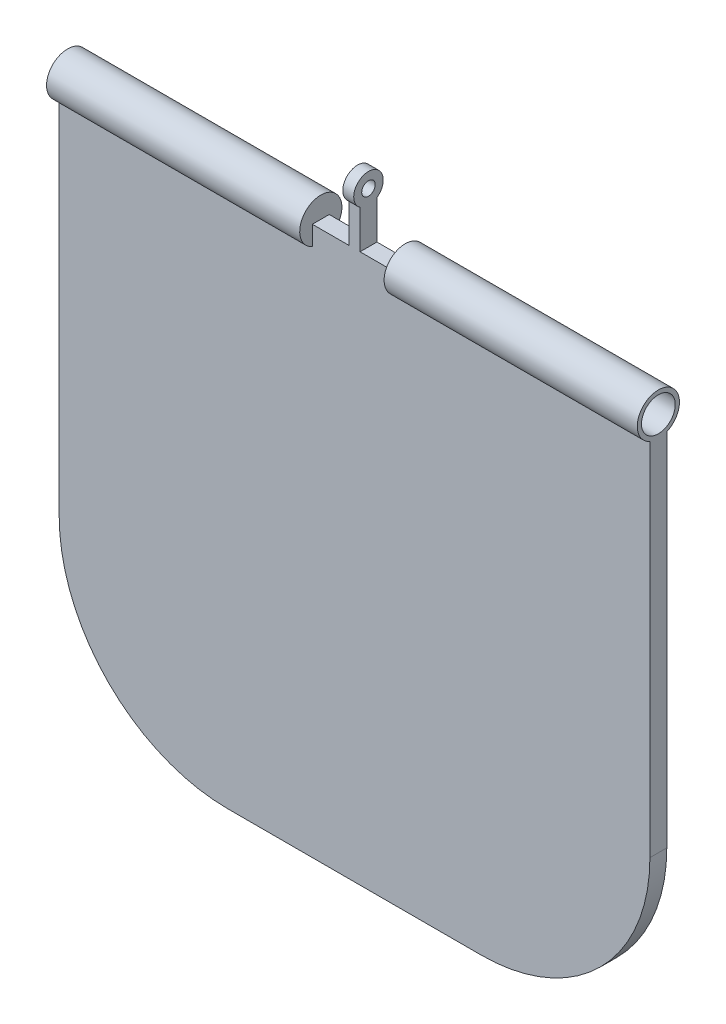
ISO-10303-21;
HEADER;
FILE_DESCRIPTION(('STEP AP214'),'2;1');
FILE_NAME('part.step','',(''),(''),'','','');
FILE_SCHEMA(('AUTOMOTIVE_DESIGN { 1 0 10303 214 1 1 1 1 }'));
ENDSEC;
DATA;
#1=APPLICATION_CONTEXT('core data for automotive mechanical design processes');
#2=APPLICATION_PROTOCOL_DEFINITION('international standard','automotive_design',2000,#1);
#3=PRODUCT_CONTEXT('',#1,'mechanical');
#4=PRODUCT('Part','Part','',(#3));
#5=PRODUCT_RELATED_PRODUCT_CATEGORY('part','',(#4));
#6=PRODUCT_DEFINITION_FORMATION('','',#4);
#7=PRODUCT_DEFINITION_CONTEXT('part definition',#1,'design');
#8=PRODUCT_DEFINITION('design','',#6,#7);
#9=PRODUCT_DEFINITION_SHAPE('','',#8);
#10=(LENGTH_UNIT() NAMED_UNIT(*) SI_UNIT(.MILLI.,.METRE.));
#11=(NAMED_UNIT(*) PLANE_ANGLE_UNIT() SI_UNIT($,.RADIAN.));
#12=(NAMED_UNIT(*) SI_UNIT($,.STERADIAN.) SOLID_ANGLE_UNIT());
#13=UNCERTAINTY_MEASURE_WITH_UNIT(LENGTH_MEASURE(1.E-05),#10,'distance_accuracy_value','');
#14=(GEOMETRIC_REPRESENTATION_CONTEXT(3) GLOBAL_UNCERTAINTY_ASSIGNED_CONTEXT((#13)) GLOBAL_UNIT_ASSIGNED_CONTEXT((#10,
#11,#12)) REPRESENTATION_CONTEXT('',''));
#15=CARTESIAN_POINT('',(0.,0.,0.));
#16=DIRECTION('',(0.,0.,1.));
#17=DIRECTION('',(1.,0.,0.));
#18=AXIS2_PLACEMENT_3D('',#15,#16,#17);
#19=CARTESIAN_POINT('',(34.9999999999999,32.5000000000003,2.00000000000017));
#20=DIRECTION('',(0.,-1.,0.));
#21=DIRECTION('',(1.,0.,0.));
#22=AXIS2_PLACEMENT_3D('',#19,#20,#21);
#23=PLANE('',#22);
#24=DIRECTION('',(0.,0.,-0.999999999999999));
#25=VECTOR('',#24,1.);
#26=CARTESIAN_POINT('',(-0.650000000000039,32.5000000000001,0.));
#27=LINE('',#26,#25);
#28=CARTESIAN_POINT('',(-0.650000000000067,32.5,2.00000000000036));
#29=VERTEX_POINT('',#28);
#30=CARTESIAN_POINT('',(-0.650000000000039,32.5000000000001,0.));
#31=VERTEX_POINT('',#30);
#32=EDGE_CURVE('E189',#29,#31,#27,.T.);
#33=ORIENTED_EDGE('',*,*,#32,.T.);
#34=DIRECTION('',(-1.,0.,0.));
#35=VECTOR('',#34,1.);
#36=CARTESIAN_POINT('',(34.9999999999999,32.5000000000004,1.11022302462516E-13));
#37=LINE('',#36,#35);
#38=CARTESIAN_POINT('',(-5.00000000000012,32.5000000000004,0.));
#39=VERTEX_POINT('',#38);
#40=EDGE_CURVE('E258',#31,#39,#37,.T.);
#41=ORIENTED_EDGE('',*,*,#40,.T.);
#42=DIRECTION('',(0.,0.,-1.));
#43=VECTOR('',#42,1.);
#44=CARTESIAN_POINT('',(-5.00000000000014,32.5,2.00000000000009));
#45=LINE('',#44,#43);
#46=CARTESIAN_POINT('',(-5.00000000000014,32.5,2.00000000000009));
#47=VERTEX_POINT('',#46);
#48=EDGE_CURVE('E206',#47,#39,#45,.T.);
#49=ORIENTED_EDGE('',*,*,#48,.F.);
#50=DIRECTION('',(-1.,0.,0.));
#51=VECTOR('',#50,1.);
#52=CARTESIAN_POINT('',(34.9999999999999,32.5000000000003,2.00000000000017));
#53=LINE('',#52,#51);
#54=EDGE_CURVE('E64',#29,#47,#53,.T.);
#55=ORIENTED_EDGE('',*,*,#54,.F.);
#56=EDGE_LOOP('',(#33,#41,#49,#55));
#57=FACE_BOUND('',#56,.T.);
#58=ADVANCED_FACE('F49',(#57),#23,.F.);
#59=CARTESIAN_POINT('',(4.99999999999984,32.5000000000003,1.38777878078145E-13));
#60=VERTEX_POINT('',#59);
#61=CARTESIAN_POINT('',(0.649999999999984,32.5000000000001,-1.11022302462516E-13));
#62=VERTEX_POINT('',#61);
#63=EDGE_CURVE('E237',#60,#62,#37,.T.);
#64=ORIENTED_EDGE('',*,*,#63,.T.);
#65=DIRECTION('',(0.,0.,-0.999999999999999));
#66=VECTOR('',#65,1.);
#67=CARTESIAN_POINT('',(0.649999999999984,32.4999999999999,4.16333634234434E-13));
#68=LINE('',#67,#66);
#69=CARTESIAN_POINT('',(0.649999999999984,32.4999999999999,2.00000000000028));
#70=VERTEX_POINT('',#69);
#71=EDGE_CURVE('E72',#70,#62,#68,.T.);
#72=ORIENTED_EDGE('',*,*,#71,.F.);
#73=CARTESIAN_POINT('',(4.99999999999984,32.5,2.0000000000002));
#74=VERTEX_POINT('',#73);
#75=EDGE_CURVE('E178',#74,#70,#53,.T.);
#76=ORIENTED_EDGE('',*,*,#75,.F.);
#77=DIRECTION('',(0.,0.,1.));
#78=VECTOR('',#77,1.);
#79=CARTESIAN_POINT('',(4.99999999999984,32.5,2.0000000000002));
#80=LINE('',#79,#78);
#81=EDGE_CURVE('E225',#60,#74,#80,.T.);
#82=ORIENTED_EDGE('',*,*,#81,.F.);
#83=EDGE_LOOP('',(#64,#72,#76,#82));
#84=FACE_BOUND('',#83,.T.);
#85=ADVANCED_FACE('F314',(#84),#23,.F.);
#86=CARTESIAN_POINT('',(15.0000000000001,-12.5,2.00000000000003));
#87=DIRECTION('',(0.,0.,1.));
#88=DIRECTION('',(1.,0.,0.));
#89=AXIS2_PLACEMENT_3D('',#86,#87,#88);
#90=PLANE('',#89);
#91=DIRECTION('',(0.,-1.,0.));
#92=VECTOR('',#91,1.);
#93=CARTESIAN_POINT('',(-4.99999999999992,-12.5,2.));
#94=LINE('',#93,#92);
#95=CARTESIAN_POINT('',(-4.99999999999992,30.2087121525225,2.));
#96=VERTEX_POINT('',#95);
#97=EDGE_CURVE('E210',#47,#96,#94,.T.);
#98=ORIENTED_EDGE('',*,*,#97,.T.);
#99=DIRECTION('',(-1.,0.,0.));
#100=VECTOR('',#99,1.);
#101=CARTESIAN_POINT('',(-4.99999999999992,30.2087121525225,2.));
#102=LINE('',#101,#100);
#103=CARTESIAN_POINT('',(-35.,30.2087121525223,1.99999999999995));
#104=VERTEX_POINT('',#103);
#105=EDGE_CURVE('E212',#96,#104,#102,.T.);
#106=ORIENTED_EDGE('',*,*,#105,.T.);
#107=DIRECTION('',(0.,-1.,0.));
#108=VECTOR('',#107,1.);
#109=CARTESIAN_POINT('',(-34.9999999999999,-12.4999999999997,2.00000000000011));
#110=LINE('',#109,#108);
#111=CARTESIAN_POINT('',(-34.9999999999999,-12.4999999999997,2.00000000000011));
#112=VERTEX_POINT('',#111);
#113=EDGE_CURVE('E234',#104,#112,#110,.T.);
#114=ORIENTED_EDGE('',*,*,#113,.T.);
#115=CARTESIAN_POINT('',(-14.9999999999999,-12.4999999999996,2.00000000000003));
#116=DIRECTION('',(0.,0.,1.));
#117=DIRECTION('',(-1.,0.,0.));
#118=AXIS2_PLACEMENT_3D('',#115,#116,#117);
#119=CIRCLE('',#118,20.);
#120=CARTESIAN_POINT('',(-14.9999999999999,-32.4999999999998,2.00000000000011));
#121=VERTEX_POINT('',#120);
#122=EDGE_CURVE('E236',#112,#121,#119,.T.);
#123=ORIENTED_EDGE('',*,*,#122,.T.);
#124=DIRECTION('',(1.,0.,0.));
#125=VECTOR('',#124,1.);
#126=CARTESIAN_POINT('',(14.9999999999999,-32.5,2.00000000000011));
#127=LINE('',#126,#125);
#128=CARTESIAN_POINT('',(14.9999999999999,-32.5,2.00000000000011));
#129=VERTEX_POINT('',#128);
#130=EDGE_CURVE('E239',#121,#129,#127,.T.);
#131=ORIENTED_EDGE('',*,*,#130,.T.);
#132=CARTESIAN_POINT('',(15.0000000000001,-12.5,2.00000000000003));
#133=DIRECTION('',(0.,0.,1.));
#134=DIRECTION('',(1.,0.,0.));
#135=AXIS2_PLACEMENT_3D('',#132,#133,#134);
#136=CIRCLE('',#135,20.);
#137=CARTESIAN_POINT('',(35.0000000000001,-12.4999999999998,2.00000000000011));
#138=VERTEX_POINT('',#137);
#139=EDGE_CURVE('E241',#129,#138,#136,.T.);
#140=ORIENTED_EDGE('',*,*,#139,.T.);
#141=DIRECTION('',(0.,1.,0.));
#142=VECTOR('',#141,1.);
#143=CARTESIAN_POINT('',(35.0000000000001,-12.4999999999998,2.00000000000011));
#144=LINE('',#143,#142);
#145=CARTESIAN_POINT('',(35.0000000000001,30.2087121525225,2.00000000000009));
#146=VERTEX_POINT('',#145);
#147=EDGE_CURVE('E243',#138,#146,#144,.T.);
#148=ORIENTED_EDGE('',*,*,#147,.T.);
#149=DIRECTION('',(1.,0.,0.));
#150=VECTOR('',#149,1.);
#151=CARTESIAN_POINT('',(5.00000000000006,30.2087121525225,2.00000000000006));
#152=LINE('',#151,#150);
#153=CARTESIAN_POINT('',(5.00000000000006,30.2087121525225,2.00000000000006));
#154=VERTEX_POINT('',#153);
#155=EDGE_CURVE('E231',#154,#146,#152,.T.);
#156=ORIENTED_EDGE('',*,*,#155,.F.);
#157=DIRECTION('',(0.,1.,0.));
#158=VECTOR('',#157,1.);
#159=CARTESIAN_POINT('',(5.00000000000012,-12.4999999999993,2.00000000000014));
#160=LINE('',#159,#158);
#161=EDGE_CURVE('E229',#154,#74,#160,.T.);
#162=ORIENTED_EDGE('',*,*,#161,.T.);
#163=ORIENTED_EDGE('',*,*,#75,.T.);
#164=DIRECTION('',(0.,1.,0.));
#165=VECTOR('',#164,1.);
#166=CARTESIAN_POINT('',(0.649999999999984,5.55111512312578E-13,2.00000000000014));
#167=LINE('',#166,#165);
#168=CARTESIAN_POINT('',(0.649999999999984,37.0638593383654,2.00000000000009));
#169=VERTEX_POINT('',#168);
#170=EDGE_CURVE('E158',#70,#169,#167,.T.);
#171=ORIENTED_EDGE('',*,*,#170,.T.);
#172=DIRECTION('',(-1.,0.,0.));
#173=VECTOR('',#172,1.);
#174=CARTESIAN_POINT('',(0.649999999999984,37.0638593383654,2.00000000000009));
#175=LINE('',#174,#173);
#176=CARTESIAN_POINT('',(-0.650000000000067,37.0638593383654,2.));
#177=VERTEX_POINT('',#176);
#178=EDGE_CURVE('E165',#169,#177,#175,.T.);
#179=ORIENTED_EDGE('',*,*,#178,.T.);
#180=DIRECTION('',(0.,1.,0.));
#181=VECTOR('',#180,1.);
#182=CARTESIAN_POINT('',(-0.650000000000067,3.33066907387547E-13,2.00000000000011));
#183=LINE('',#182,#181);
#184=EDGE_CURVE('E187',#29,#177,#183,.T.);
#185=ORIENTED_EDGE('',*,*,#184,.F.);
#186=ORIENTED_EDGE('',*,*,#54,.T.);
#187=EDGE_LOOP('',(#98,#106,#114,#123,#131,#140,#148,#156,#162,#163,#171,#179,#185,#186));
#188=FACE_BOUND('',#187,.T.);
#189=ADVANCED_FACE('F176',(#188),#90,.T.);
#190=CARTESIAN_POINT('',(15.0000000000001,-12.5000000000001,0.));
#191=DIRECTION('',(0.,0.,1.));
#192=DIRECTION('',(1.,0.,0.));
#193=AXIS2_PLACEMENT_3D('',#190,#191,#192);
#194=PLANE('',#193);
#195=DIRECTION('',(-1.,0.,0.));
#196=VECTOR('',#195,1.);
#197=CARTESIAN_POINT('',(-4.99999999999991,30.2087121525225,0.));
#198=LINE('',#197,#196);
#199=CARTESIAN_POINT('',(-4.99999999999991,30.2087121525225,0.));
#200=VERTEX_POINT('',#199);
#201=CARTESIAN_POINT('',(-35.,30.2087121525223,0.));
#202=VERTEX_POINT('',#201);
#203=EDGE_CURVE('E11',#200,#202,#198,.T.);
#204=ORIENTED_EDGE('',*,*,#203,.F.);
#205=DIRECTION('',(0.,-1.,0.));
#206=VECTOR('',#205,1.);
#207=CARTESIAN_POINT('',(-4.99999999999992,-12.5,2.22044604925031E-13));
#208=LINE('',#207,#206);
#209=EDGE_CURVE('E57',#39,#200,#208,.T.);
#210=ORIENTED_EDGE('',*,*,#209,.F.);
#211=ORIENTED_EDGE('',*,*,#40,.F.);
#212=DIRECTION('',(0.,-1.,0.));
#213=VECTOR('',#212,1.);
#214=CARTESIAN_POINT('',(-0.650000000000067,-1.11022302462516E-13,0.));
#215=LINE('',#214,#213);
#216=CARTESIAN_POINT('',(-0.650000000000067,37.0638593383653,1.66533453693773E-13));
#217=VERTEX_POINT('',#216);
#218=EDGE_CURVE('E191',#217,#31,#215,.T.);
#219=ORIENTED_EDGE('',*,*,#218,.F.);
#220=DIRECTION('',(-1.,0.,0.));
#221=VECTOR('',#220,1.);
#222=CARTESIAN_POINT('',(0.649999999999984,37.0638593383655,0.));
#223=LINE('',#222,#221);
#224=CARTESIAN_POINT('',(0.649999999999984,37.0638593383655,0.));
#225=VERTEX_POINT('',#224);
#226=EDGE_CURVE('E173',#225,#217,#223,.T.);
#227=ORIENTED_EDGE('',*,*,#226,.F.);
#228=DIRECTION('',(0.,-1.,0.));
#229=VECTOR('',#228,1.);
#230=CARTESIAN_POINT('',(0.650000000000039,0.,0.));
#231=LINE('',#230,#229);
#232=EDGE_CURVE('E160',#225,#62,#231,.T.);
#233=ORIENTED_EDGE('',*,*,#232,.T.);
#234=ORIENTED_EDGE('',*,*,#63,.F.);
#235=DIRECTION('',(0.,1.,0.));
#236=VECTOR('',#235,1.);
#237=CARTESIAN_POINT('',(5.00000000000012,-12.5000000000001,-1.94289029309402E-13));
#238=LINE('',#237,#236);
#239=CARTESIAN_POINT('',(5.00000000000006,30.2087121525225,0.));
#240=VERTEX_POINT('',#239);
#241=EDGE_CURVE('E271',#240,#60,#238,.T.);
#242=ORIENTED_EDGE('',*,*,#241,.F.);
#243=DIRECTION('',(1.,0.,0.));
#244=VECTOR('',#243,1.);
#245=CARTESIAN_POINT('',(5.00000000000006,30.2087121525225,0.));
#246=LINE('',#245,#244);
#247=CARTESIAN_POINT('',(35.0000000000001,30.2087121525225,0.));
#248=VERTEX_POINT('',#247);
#249=EDGE_CURVE('E273',#240,#248,#246,.T.);
#250=ORIENTED_EDGE('',*,*,#249,.T.);
#251=DIRECTION('',(0.,1.,0.));
#252=VECTOR('',#251,1.);
#253=CARTESIAN_POINT('',(35.0000000000001,-12.4999999999998,0.));
#254=LINE('',#253,#252);
#255=CARTESIAN_POINT('',(35.0000000000001,-12.4999999999998,0.));
#256=VERTEX_POINT('',#255);
#257=EDGE_CURVE('E255',#256,#248,#254,.T.);
#258=ORIENTED_EDGE('',*,*,#257,.F.);
#259=CARTESIAN_POINT('',(15.0000000000001,-12.5000000000001,0.));
#260=DIRECTION('',(0.,0.,1.));
#261=DIRECTION('',(1.,0.,0.));
#262=AXIS2_PLACEMENT_3D('',#259,#260,#261);
#263=CIRCLE('',#262,20.);
#264=CARTESIAN_POINT('',(14.9999999999999,-32.5,0.));
#265=VERTEX_POINT('',#264);
#266=EDGE_CURVE('E253',#265,#256,#263,.T.);
#267=ORIENTED_EDGE('',*,*,#266,.F.);
#268=DIRECTION('',(1.,0.,0.));
#269=VECTOR('',#268,1.);
#270=CARTESIAN_POINT('',(14.9999999999999,-32.5,0.));
#271=LINE('',#270,#269);
#272=CARTESIAN_POINT('',(-14.9999999999999,-32.5,0.));
#273=VERTEX_POINT('',#272);
#274=EDGE_CURVE('E251',#273,#265,#271,.T.);
#275=ORIENTED_EDGE('',*,*,#274,.F.);
#276=CARTESIAN_POINT('',(-14.9999999999999,-12.4999999999998,1.11022302462516E-13));
#277=DIRECTION('',(0.,0.,1.));
#278=DIRECTION('',(-1.,0.,0.));
#279=AXIS2_PLACEMENT_3D('',#276,#277,#278);
#280=CIRCLE('',#279,20.);
#281=CARTESIAN_POINT('',(-35.,-12.5,1.66533453693773E-13));
#282=VERTEX_POINT('',#281);
#283=EDGE_CURVE('E249',#282,#273,#280,.T.);
#284=ORIENTED_EDGE('',*,*,#283,.F.);
#285=DIRECTION('',(0.,-1.,0.));
#286=VECTOR('',#285,1.);
#287=CARTESIAN_POINT('',(-35.,-12.5,1.66533453693773E-13));
#288=LINE('',#287,#286);
#289=EDGE_CURVE('E233',#202,#282,#288,.T.);
#290=ORIENTED_EDGE('',*,*,#289,.F.);
#291=EDGE_LOOP('',(#204,#210,#211,#219,#227,#233,#234,#242,#250,#258,#267,#275,#284,#290));
#292=FACE_BOUND('',#291,.T.);
#293=ADVANCED_FACE('F285',(#292),#194,.F.);
#294=CARTESIAN_POINT('',(-34.9999999999999,-12.4999999999997,2.00000000000011));
#295=DIRECTION('',(1.,0.,0.));
#296=DIRECTION('',(0.,0.,-1.));
#297=AXIS2_PLACEMENT_3D('',#294,#295,#296);
#298=PLANE('',#297);
#299=CARTESIAN_POINT('',(-35.0000000000002,32.4999999999995,1.00000000000011));
#300=DIRECTION('',(1.,0.,0.));
#301=DIRECTION('',(0.,0.,-1.));
#302=AXIS2_PLACEMENT_3D('',#299,#300,#301);
#303=CIRCLE('',#302,2.);
#304=CARTESIAN_POINT('',(-35.0000000000002,32.4999999999995,-0.999999999999889));
#305=VERTEX_POINT('',#304);
#306=EDGE_CURVE('E172',#305,#305,#303,.T.);
#307=ORIENTED_EDGE('',*,*,#306,.T.);
#308=EDGE_LOOP('',(#307));
#309=FACE_BOUND('',#308,.T.);
#310=ORIENTED_EDGE('',*,*,#113,.F.);
#311=CARTESIAN_POINT('',(-35.0000000000002,32.4999999999995,1.00000000000011));
#312=DIRECTION('',(1.,0.,0.));
#313=DIRECTION('',(0.,0.,-1.));
#314=AXIS2_PLACEMENT_3D('',#311,#312,#313);
#315=CIRCLE('',#314,2.5);
#316=EDGE_CURVE('E200',#202,#104,#315,.T.);
#317=ORIENTED_EDGE('',*,*,#316,.F.);
#318=ORIENTED_EDGE('',*,*,#289,.T.);
#319=DIRECTION('',(0.,0.,-1.));
#320=VECTOR('',#319,1.);
#321=CARTESIAN_POINT('',(-34.9999999999999,-12.4999999999997,2.00000000000011));
#322=LINE('',#321,#320);
#323=EDGE_CURVE('E268',#112,#282,#322,.T.);
#324=ORIENTED_EDGE('',*,*,#323,.F.);
#325=EDGE_LOOP('',(#310,#317,#318,#324));
#326=FACE_BOUND('',#325,.T.);
#327=ADVANCED_FACE('F51',(#309,#326),#298,.F.);
#328=CARTESIAN_POINT('',(-14.9999999999999,-12.4999999999996,2.00000000000003));
#329=DIRECTION('',(0.,0.,-1.));
#330=DIRECTION('',(-1.,0.,0.));
#331=AXIS2_PLACEMENT_3D('',#328,#329,#330);
#332=CYLINDRICAL_SURFACE('',#331,20.);
#333=ORIENTED_EDGE('',*,*,#283,.T.);
#334=DIRECTION('',(0.,0.,-1.));
#335=VECTOR('',#334,1.);
#336=CARTESIAN_POINT('',(-14.9999999999999,-32.4999999999998,2.00000000000011));
#337=LINE('',#336,#335);
#338=EDGE_CURVE('E265',#121,#273,#337,.T.);
#339=ORIENTED_EDGE('',*,*,#338,.F.);
#340=ORIENTED_EDGE('',*,*,#122,.F.);
#341=ORIENTED_EDGE('',*,*,#323,.T.);
#342=EDGE_LOOP('',(#333,#339,#340,#341));
#343=FACE_BOUND('',#342,.T.);
#344=ADVANCED_FACE('F335',(#343),#332,.T.);
#345=CARTESIAN_POINT('',(14.9999999999999,-32.5,2.00000000000011));
#346=DIRECTION('',(0.,1.,0.));
#347=DIRECTION('',(-1.,0.,0.));
#348=AXIS2_PLACEMENT_3D('',#345,#346,#347);
#349=PLANE('',#348);
#350=ORIENTED_EDGE('',*,*,#274,.T.);
#351=DIRECTION('',(0.,0.,-1.));
#352=VECTOR('',#351,1.);
#353=CARTESIAN_POINT('',(14.9999999999999,-32.5,2.00000000000011));
#354=LINE('',#353,#352);
#355=EDGE_CURVE('E262',#129,#265,#354,.T.);
#356=ORIENTED_EDGE('',*,*,#355,.F.);
#357=ORIENTED_EDGE('',*,*,#130,.F.);
#358=ORIENTED_EDGE('',*,*,#338,.T.);
#359=EDGE_LOOP('',(#350,#356,#357,#358));
#360=FACE_BOUND('',#359,.T.);
#361=ADVANCED_FACE('F332',(#360),#349,.F.);
#362=CARTESIAN_POINT('',(15.0000000000001,-12.5,2.00000000000003));
#363=DIRECTION('',(0.,0.,-1.));
#364=DIRECTION('',(-1.,0.,0.));
#365=AXIS2_PLACEMENT_3D('',#362,#363,#364);
#366=CYLINDRICAL_SURFACE('',#365,20.);
#367=ORIENTED_EDGE('',*,*,#266,.T.);
#368=DIRECTION('',(0.,0.,-1.));
#369=VECTOR('',#368,1.);
#370=CARTESIAN_POINT('',(35.0000000000001,-12.4999999999998,2.00000000000011));
#371=LINE('',#370,#369);
#372=EDGE_CURVE('E247',#138,#256,#371,.T.);
#373=ORIENTED_EDGE('',*,*,#372,.F.);
#374=ORIENTED_EDGE('',*,*,#139,.F.);
#375=ORIENTED_EDGE('',*,*,#355,.T.);
#376=EDGE_LOOP('',(#367,#373,#374,#375));
#377=FACE_BOUND('',#376,.T.);
#378=ADVANCED_FACE('F328',(#377),#366,.T.);
#379=CARTESIAN_POINT('',(35.0000000000001,-12.4999999999998,2.00000000000011));
#380=DIRECTION('',(-1.,0.,0.));
#381=DIRECTION('',(0.,0.,1.));
#382=AXIS2_PLACEMENT_3D('',#379,#380,#381);
#383=PLANE('',#382);
#384=CARTESIAN_POINT('',(34.9999999999998,32.5000000000004,1.));
#385=DIRECTION('',(1.,0.,0.));
#386=DIRECTION('',(0.,0.,-1.));
#387=AXIS2_PLACEMENT_3D('',#384,#385,#386);
#388=CIRCLE('',#387,2.);
#389=CARTESIAN_POINT('',(34.9999999999998,32.5000000000004,-1.));
#390=VERTEX_POINT('',#389);
#391=EDGE_CURVE('E215',#390,#390,#388,.T.);
#392=ORIENTED_EDGE('',*,*,#391,.F.);
#393=EDGE_LOOP('',(#392));
#394=FACE_BOUND('',#393,.T.);
#395=ORIENTED_EDGE('',*,*,#257,.T.);
#396=CARTESIAN_POINT('',(34.9999999999998,32.5000000000004,1.));
#397=DIRECTION('',(1.,0.,0.));
#398=DIRECTION('',(0.,0.,-1.));
#399=AXIS2_PLACEMENT_3D('',#396,#397,#398);
#400=CIRCLE('',#399,2.5);
#401=EDGE_CURVE('E219',#248,#146,#400,.T.);
#402=ORIENTED_EDGE('',*,*,#401,.T.);
#403=ORIENTED_EDGE('',*,*,#147,.F.);
#404=ORIENTED_EDGE('',*,*,#372,.T.);
#405=EDGE_LOOP('',(#395,#402,#403,#404));
#406=FACE_BOUND('',#405,.T.);
#407=ADVANCED_FACE('F324',(#394,#406),#383,.F.);
#408=CARTESIAN_POINT('',(4.99999999999984,32.4999999999999,1.00000000000006));
#409=DIRECTION('',(1.,0.,0.));
#410=DIRECTION('',(0.,0.,-1.));
#411=AXIS2_PLACEMENT_3D('',#408,#409,#410);
#412=CYLINDRICAL_SURFACE('',#411,2.5);
#413=CARTESIAN_POINT('',(4.99999999999984,32.4999999999999,1.00000000000006));
#414=DIRECTION('',(1.,0.,0.));
#415=DIRECTION('',(0.,0.,-1.));
#416=AXIS2_PLACEMENT_3D('',#413,#414,#415);
#417=CIRCLE('',#416,2.5);
#418=EDGE_CURVE('E222',#240,#154,#417,.T.);
#419=ORIENTED_EDGE('',*,*,#418,.T.);
#420=ORIENTED_EDGE('',*,*,#155,.T.);
#421=ORIENTED_EDGE('',*,*,#401,.F.);
#422=ORIENTED_EDGE('',*,*,#249,.F.);
#423=EDGE_LOOP('',(#419,#420,#421,#422));
#424=FACE_BOUND('',#423,.T.);
#425=ADVANCED_FACE('F327',(#424),#412,.T.);
#426=CARTESIAN_POINT('',(5.00000000000012,0.,0.));
#427=DIRECTION('',(1.,0.,0.));
#428=DIRECTION('',(0.,0.,-1.));
#429=AXIS2_PLACEMENT_3D('',#426,#427,#428);
#430=PLANE('',#429);
#431=ORIENTED_EDGE('',*,*,#161,.F.);
#432=ORIENTED_EDGE('',*,*,#418,.F.);
#433=ORIENTED_EDGE('',*,*,#241,.T.);
#434=ORIENTED_EDGE('',*,*,#81,.T.);
#435=EDGE_LOOP('',(#431,#432,#433,#434));
#436=FACE_BOUND('',#435,.T.);
#437=ADVANCED_FACE('F359',(#436),#430,.F.);
#438=CARTESIAN_POINT('',(9.99999999999995,32.4999999999999,1.00000000000008));
#439=DIRECTION('',(1.,0.,0.));
#440=DIRECTION('',(0.,0.,-1.));
#441=AXIS2_PLACEMENT_3D('',#438,#439,#440);
#442=CYLINDRICAL_SURFACE('',#441,2.);
#443=CARTESIAN_POINT('',(9.99999999999995,32.4999999999999,1.00000000000008));
#444=DIRECTION('',(1.,0.,0.));
#445=DIRECTION('',(0.,0.,-1.));
#446=AXIS2_PLACEMENT_3D('',#443,#444,#445);
#447=CIRCLE('',#446,2.);
#448=CARTESIAN_POINT('',(9.99999999999995,32.4999999999999,-0.999999999999916));
#449=VERTEX_POINT('',#448);
#450=EDGE_CURVE('E216',#449,#449,#447,.T.);
#451=ORIENTED_EDGE('',*,*,#450,.F.);
#452=EDGE_LOOP('',(#451));
#453=FACE_BOUND('',#452,.T.);
#454=ORIENTED_EDGE('',*,*,#391,.T.);
#455=EDGE_LOOP('',(#454));
#456=FACE_BOUND('',#455,.T.);
#457=ADVANCED_FACE('F363',(#453,#456),#442,.F.);
#458=CARTESIAN_POINT('',(10.,0.,0.));
#459=DIRECTION('',(1.,0.,0.));
#460=DIRECTION('',(0.,0.,-1.));
#461=AXIS2_PLACEMENT_3D('',#458,#459,#460);
#462=PLANE('',#461);
#463=ORIENTED_EDGE('',*,*,#450,.T.);
#464=EDGE_LOOP('',(#463));
#465=FACE_BOUND('',#464,.T.);
#466=ADVANCED_FACE('F369',(#465),#462,.T.);
#467=CARTESIAN_POINT('',(-5.00000000000014,32.5,1.00000000000006));
#468=DIRECTION('',(-1.,0.,0.));
#469=DIRECTION('',(0.,0.,1.));
#470=AXIS2_PLACEMENT_3D('',#467,#468,#469);
#471=CYLINDRICAL_SURFACE('',#470,2.5);
#472=ORIENTED_EDGE('',*,*,#105,.F.);
#473=CARTESIAN_POINT('',(-5.00000000000014,32.5,1.00000000000006));
#474=DIRECTION('',(1.,0.,0.));
#475=DIRECTION('',(0.,0.,-1.));
#476=AXIS2_PLACEMENT_3D('',#473,#474,#475);
#477=CIRCLE('',#476,2.5);
#478=EDGE_CURVE('E203',#200,#96,#477,.T.);
#479=ORIENTED_EDGE('',*,*,#478,.F.);
#480=ORIENTED_EDGE('',*,*,#203,.T.);
#481=ORIENTED_EDGE('',*,*,#316,.T.);
#482=EDGE_LOOP('',(#472,#479,#480,#481));
#483=FACE_BOUND('',#482,.T.);
#484=ADVANCED_FACE('F283',(#483),#471,.T.);
#485=CARTESIAN_POINT('',(-5.00000000000014,0.,-1.94289029309402E-13));
#486=DIRECTION('',(-1.,0.,0.));
#487=DIRECTION('',(0.,0.,-1.));
#488=AXIS2_PLACEMENT_3D('',#485,#486,#487);
#489=PLANE('',#488);
#490=ORIENTED_EDGE('',*,*,#97,.F.);
#491=ORIENTED_EDGE('',*,*,#48,.T.);
#492=ORIENTED_EDGE('',*,*,#209,.T.);
#493=ORIENTED_EDGE('',*,*,#478,.T.);
#494=EDGE_LOOP('',(#490,#491,#492,#493));
#495=FACE_BOUND('',#494,.T.);
#496=ADVANCED_FACE('F279',(#495),#489,.F.);
#497=CARTESIAN_POINT('',(-10.,32.5000000000001,1.00000000000006));
#498=DIRECTION('',(-1.,0.,0.));
#499=DIRECTION('',(0.,0.,1.));
#500=AXIS2_PLACEMENT_3D('',#497,#498,#499);
#501=CYLINDRICAL_SURFACE('',#500,2.);
#502=CARTESIAN_POINT('',(-10.,32.5000000000001,1.00000000000006));
#503=DIRECTION('',(1.,0.,0.));
#504=DIRECTION('',(0.,0.,-1.));
#505=AXIS2_PLACEMENT_3D('',#502,#503,#504);
#506=CIRCLE('',#505,2.);
#507=CARTESIAN_POINT('',(-10.,32.5000000000001,-0.999999999999944));
#508=VERTEX_POINT('',#507);
#509=EDGE_CURVE('E197',#508,#508,#506,.T.);
#510=ORIENTED_EDGE('',*,*,#509,.T.);
#511=EDGE_LOOP('',(#510));
#512=FACE_BOUND('',#511,.T.);
#513=ORIENTED_EDGE('',*,*,#306,.F.);
#514=EDGE_LOOP('',(#513));
#515=FACE_BOUND('',#514,.T.);
#516=ADVANCED_FACE('F435',(#512,#515),#501,.F.);
#517=CARTESIAN_POINT('',(-10.,-1.11022302462516E-13,0.));
#518=DIRECTION('',(-1.,0.,0.));
#519=DIRECTION('',(0.,0.,-1.));
#520=AXIS2_PLACEMENT_3D('',#517,#518,#519);
#521=PLANE('',#520);
#522=ORIENTED_EDGE('',*,*,#509,.F.);
#523=EDGE_LOOP('',(#522));
#524=FACE_BOUND('',#523,.T.);
#525=ADVANCED_FACE('F311',(#524),#521,.T.);
#526=CARTESIAN_POINT('',(0.649999999999762,38.5000000000004,1.0000000000002));
#527=DIRECTION('',(-1.,0.,0.));
#528=DIRECTION('',(0.,0.,1.));
#529=AXIS2_PLACEMENT_3D('',#526,#527,#528);
#530=CYLINDRICAL_SURFACE('',#529,1.75);
#531=CARTESIAN_POINT('',(-0.650000000000067,38.4999999999998,0.999999999999918));
#532=DIRECTION('',(1.,0.,0.));
#533=DIRECTION('',(0.,0.,-1.));
#534=AXIS2_PLACEMENT_3D('',#531,#532,#533);
#535=CIRCLE('',#534,1.75);
#536=EDGE_CURVE('E168',#217,#177,#535,.T.);
#537=ORIENTED_EDGE('',*,*,#536,.T.);
#538=ORIENTED_EDGE('',*,*,#178,.F.);
#539=CARTESIAN_POINT('',(0.649999999999762,38.5000000000004,1.0000000000002));
#540=DIRECTION('',(1.,0.,0.));
#541=DIRECTION('',(0.,0.,-1.));
#542=AXIS2_PLACEMENT_3D('',#539,#540,#541);
#543=CIRCLE('',#542,1.75);
#544=EDGE_CURVE('E153',#225,#169,#543,.T.);
#545=ORIENTED_EDGE('',*,*,#544,.F.);
#546=ORIENTED_EDGE('',*,*,#226,.T.);
#547=EDGE_LOOP('',(#537,#538,#545,#546));
#548=FACE_BOUND('',#547,.T.);
#549=ADVANCED_FACE('F166',(#548),#530,.T.);
#550=CARTESIAN_POINT('',(0.649999999999762,38.5000000000004,1.0000000000002));
#551=DIRECTION('',(-1.,0.,0.));
#552=DIRECTION('',(0.,0.,1.));
#553=AXIS2_PLACEMENT_3D('',#550,#551,#552);
#554=CYLINDRICAL_SURFACE('',#553,0.800000000000003);
#555=CARTESIAN_POINT('',(0.649999999999762,38.5000000000004,1.0000000000002));
#556=DIRECTION('',(1.,0.,0.));
#557=DIRECTION('',(0.,0.,-1.));
#558=AXIS2_PLACEMENT_3D('',#555,#556,#557);
#559=CIRCLE('',#558,0.800000000000003);
#560=CARTESIAN_POINT('',(0.649999999999762,38.5000000000004,0.200000000000192));
#561=VERTEX_POINT('',#560);
#562=EDGE_CURVE('E183',#561,#561,#559,.T.);
#563=ORIENTED_EDGE('',*,*,#562,.T.);
#564=EDGE_LOOP('',(#563));
#565=FACE_BOUND('',#564,.T.);
#566=CARTESIAN_POINT('',(-0.650000000000067,38.4999999999998,0.999999999999918));
#567=DIRECTION('',(1.,0.,0.));
#568=DIRECTION('',(0.,0.,-1.));
#569=AXIS2_PLACEMENT_3D('',#566,#567,#568);
#570=CIRCLE('',#569,0.800000000000003);
#571=CARTESIAN_POINT('',(-0.650000000000067,38.4999999999998,0.199999999999915));
#572=VERTEX_POINT('',#571);
#573=EDGE_CURVE('E162',#572,#572,#570,.T.);
#574=ORIENTED_EDGE('',*,*,#573,.F.);
#575=EDGE_LOOP('',(#574));
#576=FACE_BOUND('',#575,.T.);
#577=ADVANCED_FACE('F300',(#565,#576),#554,.F.);
#578=CARTESIAN_POINT('',(0.650000000000039,0.,0.));
#579=DIRECTION('',(1.,0.,0.));
#580=DIRECTION('',(0.,0.,-1.));
#581=AXIS2_PLACEMENT_3D('',#578,#579,#580);
#582=PLANE('',#581);
#583=ORIENTED_EDGE('',*,*,#544,.T.);
#584=ORIENTED_EDGE('',*,*,#170,.F.);
#585=ORIENTED_EDGE('',*,*,#71,.T.);
#586=ORIENTED_EDGE('',*,*,#232,.F.);
#587=EDGE_LOOP('',(#583,#584,#585,#586));
#588=FACE_BOUND('',#587,.T.);
#589=ORIENTED_EDGE('',*,*,#562,.F.);
#590=EDGE_LOOP('',(#589));
#591=FACE_BOUND('',#590,.T.);
#592=ADVANCED_FACE('F155',(#588,#591),#582,.T.);
#593=CARTESIAN_POINT('',(-0.650000000000067,-1.11022302462516E-13,0.));
#594=DIRECTION('',(1.,0.,0.));
#595=DIRECTION('',(0.,0.,-1.));
#596=AXIS2_PLACEMENT_3D('',#593,#594,#595);
#597=PLANE('',#596);
#598=ORIENTED_EDGE('',*,*,#536,.F.);
#599=ORIENTED_EDGE('',*,*,#218,.T.);
#600=ORIENTED_EDGE('',*,*,#32,.F.);
#601=ORIENTED_EDGE('',*,*,#184,.T.);
#602=EDGE_LOOP('',(#598,#599,#600,#601));
#603=FACE_BOUND('',#602,.T.);
#604=ORIENTED_EDGE('',*,*,#573,.T.);
#605=EDGE_LOOP('',(#604));
#606=FACE_BOUND('',#605,.T.);
#607=ADVANCED_FACE('F294',(#603,#606),#597,.F.);
#608=CLOSED_SHELL('',(#58,#85,#189,#293,#327,#344,#361,#378,#407,#425,#437,#457,#466,#484,#496,
#516,#525,#549,#577,#592,#607));
#609=MANIFOLD_SOLID_BREP('B2',#608);
#610=ADVANCED_BREP_SHAPE_REPRESENTATION('',(#18,#609),#14);
#611=SHAPE_DEFINITION_REPRESENTATION(#9,#610);
ENDSEC;
END-ISO-10303-21;
